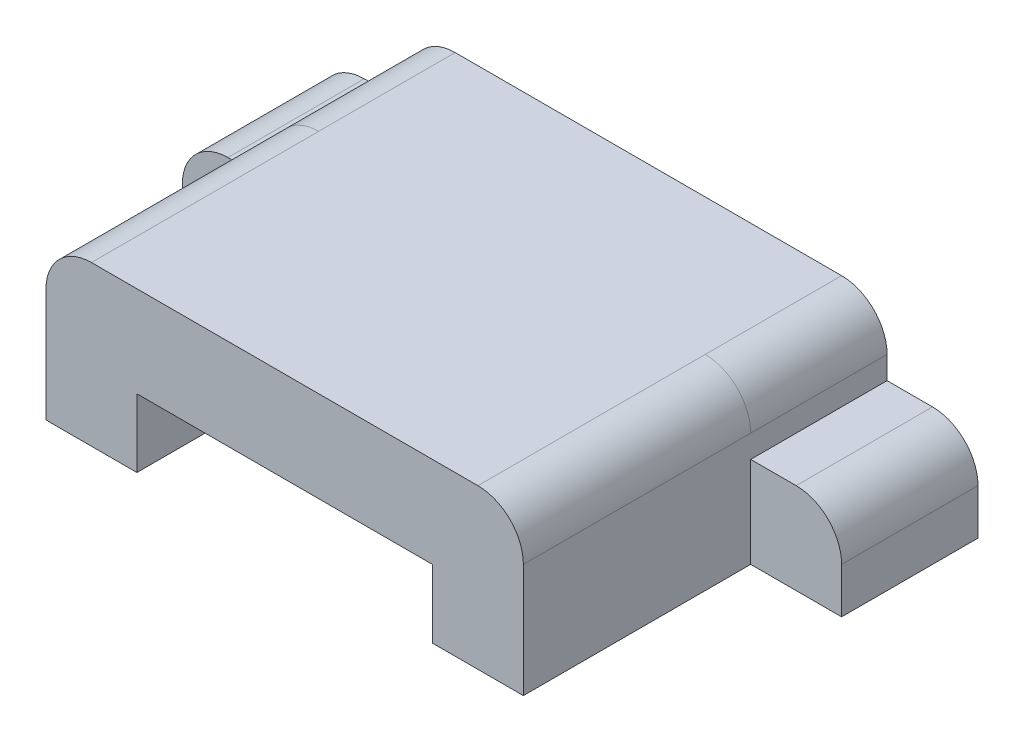
ISO-10303-21;
HEADER;
FILE_DESCRIPTION(('STEP AP214'),'2;1');
FILE_NAME('part.step','',(''),(''),'','','');
FILE_SCHEMA(('AUTOMOTIVE_DESIGN { 1 0 10303 214 1 1 1 1 }'));
ENDSEC;
DATA;
#1=APPLICATION_CONTEXT('core data for automotive mechanical design processes');
#2=APPLICATION_PROTOCOL_DEFINITION('international standard','automotive_design',2000,#1);
#3=PRODUCT_CONTEXT('',#1,'mechanical');
#4=PRODUCT('Part','Part','',(#3));
#5=PRODUCT_RELATED_PRODUCT_CATEGORY('part','',(#4));
#6=PRODUCT_DEFINITION_FORMATION('','',#4);
#7=PRODUCT_DEFINITION_CONTEXT('part definition',#1,'design');
#8=PRODUCT_DEFINITION('design','',#6,#7);
#9=PRODUCT_DEFINITION_SHAPE('','',#8);
#10=(LENGTH_UNIT() NAMED_UNIT(*) SI_UNIT(.MILLI.,.METRE.));
#11=(NAMED_UNIT(*) PLANE_ANGLE_UNIT() SI_UNIT($,.RADIAN.));
#12=(NAMED_UNIT(*) SI_UNIT($,.STERADIAN.) SOLID_ANGLE_UNIT());
#13=UNCERTAINTY_MEASURE_WITH_UNIT(LENGTH_MEASURE(1.E-05),#10,'distance_accuracy_value','');
#14=(GEOMETRIC_REPRESENTATION_CONTEXT(3) GLOBAL_UNCERTAINTY_ASSIGNED_CONTEXT((#13)) GLOBAL_UNIT_ASSIGNED_CONTEXT((#10,
#11,#12)) REPRESENTATION_CONTEXT('',''));
#15=CARTESIAN_POINT('',(0.,0.,0.));
#16=DIRECTION('',(0.,0.,1.));
#17=DIRECTION('',(1.,0.,0.));
#18=AXIS2_PLACEMENT_3D('',#15,#16,#17);
#19=CARTESIAN_POINT('',(0.,0.,6.));
#20=DIRECTION('',(0.,0.,-1.));
#21=DIRECTION('',(-1.,0.,0.));
#22=AXIS2_PLACEMENT_3D('',#19,#20,#21);
#23=PLANE('',#22);
#24=DIRECTION('',(0.,-1.,0.));
#25=VECTOR('',#24,1.);
#26=CARTESIAN_POINT('',(-12.4615384615385,-4.74358974358974,6.));
#27=LINE('',#26,#25);
#28=CARTESIAN_POINT('',(-12.4615384615385,-4.74358974358974,6.));
#29=VERTEX_POINT('',#28);
#30=CARTESIAN_POINT('',(-12.4615384615385,-8.74358974358974,6.));
#31=VERTEX_POINT('',#30);
#32=EDGE_CURVE('E220',#29,#31,#27,.T.);
#33=ORIENTED_EDGE('',*,*,#32,.F.);
#34=DIRECTION('',(-1.,0.,0.));
#35=VECTOR('',#34,1.);
#36=CARTESIAN_POINT('',(-16.4615384615385,-4.74358974358974,6.));
#37=LINE('',#36,#35);
#38=CARTESIAN_POINT('',(-14.4615384615385,-4.74358974358974,6.));
#39=VERTEX_POINT('',#38);
#40=EDGE_CURVE('E243',#29,#39,#37,.T.);
#41=ORIENTED_EDGE('',*,*,#40,.T.);
#42=CARTESIAN_POINT('',(-14.4615384615385,-6.74358974358974,6.));
#43=DIRECTION('',(0.,0.,-1.));
#44=DIRECTION('',(-1.,0.,0.));
#45=AXIS2_PLACEMENT_3D('',#42,#43,#44);
#46=CIRCLE('',#45,2.);
#47=CARTESIAN_POINT('',(-16.4615384615385,-6.74358974358974,6.));
#48=VERTEX_POINT('',#47);
#49=EDGE_CURVE('E305',#39,#48,#46,.F.);
#50=ORIENTED_EDGE('',*,*,#49,.T.);
#51=DIRECTION('',(0.,-1.,0.));
#52=VECTOR('',#51,1.);
#53=CARTESIAN_POINT('',(-16.4615384615385,-8.74358974358974,6.));
#54=LINE('',#53,#52);
#55=CARTESIAN_POINT('',(-16.4615384615385,-8.74358974358974,6.));
#56=VERTEX_POINT('',#55);
#57=EDGE_CURVE('E231',#48,#56,#54,.T.);
#58=ORIENTED_EDGE('',*,*,#57,.T.);
#59=DIRECTION('',(1.,0.,0.));
#60=VECTOR('',#59,1.);
#61=CARTESIAN_POINT('',(-16.4615384615385,-8.74358974358974,6.));
#62=LINE('',#61,#60);
#63=EDGE_CURVE('E233',#56,#31,#62,.T.);
#64=ORIENTED_EDGE('',*,*,#63,.T.);
#65=EDGE_LOOP('',(#33,#41,#50,#58,#64));
#66=FACE_BOUND('',#65,.T.);
#67=ADVANCED_FACE('F39',(#66),#23,.F.);
#68=DIRECTION('',(0.,1.,0.));
#69=VECTOR('',#68,1.);
#70=CARTESIAN_POINT('',(8.53846153846154,-1.74358974358975,6.));
#71=LINE('',#70,#69);
#72=CARTESIAN_POINT('',(8.53846153846154,-8.74358974358974,6.));
#73=VERTEX_POINT('',#72);
#74=CARTESIAN_POINT('',(8.53846153846154,-4.74358974358974,6.));
#75=VERTEX_POINT('',#74);
#76=EDGE_CURVE('E204',#73,#75,#71,.T.);
#77=ORIENTED_EDGE('',*,*,#76,.F.);
#78=DIRECTION('',(1.,0.,0.));
#79=VECTOR('',#78,1.);
#80=CARTESIAN_POINT('',(4.53846153846154,-8.74358974358975,6.));
#81=LINE('',#80,#79);
#82=CARTESIAN_POINT('',(12.5384615384615,-8.74358974358974,6.));
#83=VERTEX_POINT('',#82);
#84=EDGE_CURVE('E236',#73,#83,#81,.T.);
#85=ORIENTED_EDGE('',*,*,#84,.T.);
#86=DIRECTION('',(0.,1.,0.));
#87=VECTOR('',#86,1.);
#88=CARTESIAN_POINT('',(12.5384615384615,-4.74358974358974,6.));
#89=LINE('',#88,#87);
#90=CARTESIAN_POINT('',(12.5384615384615,-6.74358974358974,6.));
#91=VERTEX_POINT('',#90);
#92=EDGE_CURVE('E238',#83,#91,#89,.T.);
#93=ORIENTED_EDGE('',*,*,#92,.T.);
#94=CARTESIAN_POINT('',(10.5384615384615,-6.74358974358974,6.));
#95=DIRECTION('',(0.,0.,-1.));
#96=DIRECTION('',(-1.,0.,0.));
#97=AXIS2_PLACEMENT_3D('',#94,#95,#96);
#98=CIRCLE('',#97,2.);
#99=CARTESIAN_POINT('',(10.5384615384615,-4.74358974358974,6.));
#100=VERTEX_POINT('',#99);
#101=EDGE_CURVE('E307',#91,#100,#98,.F.);
#102=ORIENTED_EDGE('',*,*,#101,.T.);
#103=DIRECTION('',(-1.,0.,0.));
#104=VECTOR('',#103,1.);
#105=CARTESIAN_POINT('',(8.53846153846154,-4.74358974358974,6.));
#106=LINE('',#105,#104);
#107=EDGE_CURVE('E241',#100,#75,#106,.T.);
#108=ORIENTED_EDGE('',*,*,#107,.T.);
#109=EDGE_LOOP('',(#77,#85,#93,#102,#108));
#110=FACE_BOUND('',#109,.T.);
#111=ADVANCED_FACE('F372',(#110),#23,.F.);
#112=CARTESIAN_POINT('',(-16.4615384615385,-8.74358974358974,6.));
#113=DIRECTION('',(1.,0.,0.));
#114=DIRECTION('',(0.,0.,-1.));
#115=AXIS2_PLACEMENT_3D('',#112,#113,#114);
#116=PLANE('',#115);
#117=ORIENTED_EDGE('',*,*,#57,.F.);
#118=DIRECTION('',(0.,0.,-1.));
#119=VECTOR('',#118,1.);
#120=CARTESIAN_POINT('',(-16.4615384615385,-6.74358974358974,6.));
#121=LINE('',#120,#119);
#122=CARTESIAN_POINT('',(-16.4615384615385,-6.74358974358974,0.));
#123=VERTEX_POINT('',#122);
#124=EDGE_CURVE('E309',#48,#123,#121,.T.);
#125=ORIENTED_EDGE('',*,*,#124,.T.);
#126=DIRECTION('',(0.,-1.,0.));
#127=VECTOR('',#126,1.);
#128=CARTESIAN_POINT('',(-16.4615384615385,-8.74358974358974,0.));
#129=LINE('',#128,#127);
#130=CARTESIAN_POINT('',(-16.4615384615385,-8.74358974358974,0.));
#131=VERTEX_POINT('',#130);
#132=EDGE_CURVE('E230',#123,#131,#129,.T.);
#133=ORIENTED_EDGE('',*,*,#132,.T.);
#134=DIRECTION('',(0.,0.,-1.));
#135=VECTOR('',#134,1.);
#136=CARTESIAN_POINT('',(-16.4615384615385,-8.74358974358974,6.));
#137=LINE('',#136,#135);
#138=EDGE_CURVE('E285',#56,#131,#137,.T.);
#139=ORIENTED_EDGE('',*,*,#138,.F.);
#140=EDGE_LOOP('',(#117,#125,#133,#139));
#141=FACE_BOUND('',#140,.T.);
#142=ADVANCED_FACE('F401',(#141),#116,.F.);
#143=CARTESIAN_POINT('',(-16.4615384615385,-8.74358974358974,6.));
#144=DIRECTION('',(0.,1.,0.));
#145=DIRECTION('',(0.,0.,1.));
#146=AXIS2_PLACEMENT_3D('',#143,#144,#145);
#147=PLANE('',#146);
#148=DIRECTION('',(1.,0.,0.));
#149=VECTOR('',#148,1.);
#150=CARTESIAN_POINT('',(-16.4615384615385,-8.74358974358974,0.));
#151=LINE('',#150,#149);
#152=CARTESIAN_POINT('',(-8.46153846153846,-8.74358974358974,0.));
#153=VERTEX_POINT('',#152);
#154=EDGE_CURVE('E248',#131,#153,#151,.T.);
#155=ORIENTED_EDGE('',*,*,#154,.T.);
#156=DIRECTION('',(0.,0.,-1.));
#157=VECTOR('',#156,1.);
#158=CARTESIAN_POINT('',(-8.46153846153846,-8.74358974358974,6.));
#159=LINE('',#158,#157);
#160=CARTESIAN_POINT('',(-8.46153846153846,-8.74358974358974,16.));
#161=VERTEX_POINT('',#160);
#162=EDGE_CURVE('E282',#161,#153,#159,.T.);
#163=ORIENTED_EDGE('',*,*,#162,.F.);
#164=DIRECTION('',(1.,0.,0.));
#165=VECTOR('',#164,1.);
#166=CARTESIAN_POINT('',(-12.4615384615385,-8.74358974358974,16.));
#167=LINE('',#166,#165);
#168=CARTESIAN_POINT('',(-12.4615384615385,-8.74358974358974,16.));
#169=VERTEX_POINT('',#168);
#170=EDGE_CURVE('E216',#169,#161,#167,.T.);
#171=ORIENTED_EDGE('',*,*,#170,.F.);
#172=DIRECTION('',(0.,0.,-1.));
#173=VECTOR('',#172,1.);
#174=CARTESIAN_POINT('',(-12.4615384615385,-8.74358974358974,16.));
#175=LINE('',#174,#173);
#176=EDGE_CURVE('E218',#169,#31,#175,.T.);
#177=ORIENTED_EDGE('',*,*,#176,.T.);
#178=ORIENTED_EDGE('',*,*,#63,.F.);
#179=ORIENTED_EDGE('',*,*,#138,.T.);
#180=EDGE_LOOP('',(#155,#163,#171,#177,#178,#179));
#181=FACE_BOUND('',#180,.T.);
#182=ADVANCED_FACE('F529',(#181),#147,.F.);
#183=CARTESIAN_POINT('',(-8.46153846153846,-5.74358974358974,6.));
#184=DIRECTION('',(-1.,0.,0.));
#185=DIRECTION('',(0.,-1.,0.));
#186=AXIS2_PLACEMENT_3D('',#183,#184,#185);
#187=PLANE('',#186);
#188=DIRECTION('',(0.,1.,0.));
#189=VECTOR('',#188,1.);
#190=CARTESIAN_POINT('',(-8.46153846153846,-5.74358974358974,0.));
#191=LINE('',#190,#189);
#192=CARTESIAN_POINT('',(-8.46153846153846,-5.74358974358974,0.));
#193=VERTEX_POINT('',#192);
#194=EDGE_CURVE('E250',#153,#193,#191,.T.);
#195=ORIENTED_EDGE('',*,*,#194,.T.);
#196=DIRECTION('',(0.,0.,-1.));
#197=VECTOR('',#196,1.);
#198=CARTESIAN_POINT('',(-8.46153846153846,-5.74358974358974,6.));
#199=LINE('',#198,#197);
#200=CARTESIAN_POINT('',(-8.46153846153846,-5.74358974358974,16.));
#201=VERTEX_POINT('',#200);
#202=EDGE_CURVE('E189',#201,#193,#199,.T.);
#203=ORIENTED_EDGE('',*,*,#202,.F.);
#204=DIRECTION('',(0.,1.,0.));
#205=VECTOR('',#204,1.);
#206=CARTESIAN_POINT('',(-8.46153846153846,-5.74358974358974,16.));
#207=LINE('',#206,#205);
#208=EDGE_CURVE('E203',#161,#201,#207,.T.);
#209=ORIENTED_EDGE('',*,*,#208,.F.);
#210=ORIENTED_EDGE('',*,*,#162,.T.);
#211=EDGE_LOOP('',(#195,#203,#209,#210));
#212=FACE_BOUND('',#211,.T.);
#213=ADVANCED_FACE('F361',(#212),#187,.F.);
#214=CARTESIAN_POINT('',(-8.46153846153846,-5.74358974358974,6.));
#215=DIRECTION('',(0.,1.,0.));
#216=DIRECTION('',(-1.,0.,0.));
#217=AXIS2_PLACEMENT_3D('',#214,#215,#216);
#218=PLANE('',#217);
#219=DIRECTION('',(1.,0.,0.));
#220=VECTOR('',#219,1.);
#221=CARTESIAN_POINT('',(-8.46153846153846,-5.74358974358974,0.));
#222=LINE('',#221,#220);
#223=CARTESIAN_POINT('',(4.53846153846154,-5.74358974358975,0.));
#224=VERTEX_POINT('',#223);
#225=EDGE_CURVE('E186',#193,#224,#222,.T.);
#226=ORIENTED_EDGE('',*,*,#225,.T.);
#227=DIRECTION('',(0.,0.,-1.));
#228=VECTOR('',#227,1.);
#229=CARTESIAN_POINT('',(4.53846153846154,-5.74358974358975,6.));
#230=LINE('',#229,#228);
#231=CARTESIAN_POINT('',(4.53846153846154,-5.74358974358975,16.));
#232=VERTEX_POINT('',#231);
#233=EDGE_CURVE('E179',#232,#224,#230,.T.);
#234=ORIENTED_EDGE('',*,*,#233,.F.);
#235=DIRECTION('',(1.,0.,0.));
#236=VECTOR('',#235,1.);
#237=CARTESIAN_POINT('',(-8.46153846153846,-5.74358974358974,16.));
#238=LINE('',#237,#236);
#239=EDGE_CURVE('E184',#201,#232,#238,.T.);
#240=ORIENTED_EDGE('',*,*,#239,.F.);
#241=ORIENTED_EDGE('',*,*,#202,.T.);
#242=EDGE_LOOP('',(#226,#234,#240,#241));
#243=FACE_BOUND('',#242,.T.);
#244=ADVANCED_FACE('F181',(#243),#218,.F.);
#245=CARTESIAN_POINT('',(4.53846153846154,-5.74358974358975,6.));
#246=DIRECTION('',(1.,0.,0.));
#247=DIRECTION('',(0.,0.,-1.));
#248=AXIS2_PLACEMENT_3D('',#245,#246,#247);
#249=PLANE('',#248);
#250=DIRECTION('',(0.,-1.,0.));
#251=VECTOR('',#250,1.);
#252=CARTESIAN_POINT('',(4.53846153846154,-5.74358974358975,0.));
#253=LINE('',#252,#251);
#254=CARTESIAN_POINT('',(4.53846153846154,-8.74358974358975,0.));
#255=VERTEX_POINT('',#254);
#256=EDGE_CURVE('E253',#224,#255,#253,.T.);
#257=ORIENTED_EDGE('',*,*,#256,.T.);
#258=DIRECTION('',(0.,0.,-1.));
#259=VECTOR('',#258,1.);
#260=CARTESIAN_POINT('',(4.53846153846154,-8.74358974358975,6.));
#261=LINE('',#260,#259);
#262=CARTESIAN_POINT('',(4.53846153846154,-8.74358974358975,16.));
#263=VERTEX_POINT('',#262);
#264=EDGE_CURVE('E190',#263,#255,#261,.T.);
#265=ORIENTED_EDGE('',*,*,#264,.F.);
#266=DIRECTION('',(0.,-1.,0.));
#267=VECTOR('',#266,1.);
#268=CARTESIAN_POINT('',(4.53846153846154,-5.74358974358975,16.));
#269=LINE('',#268,#267);
#270=EDGE_CURVE('E193',#232,#263,#269,.T.);
#271=ORIENTED_EDGE('',*,*,#270,.F.);
#272=ORIENTED_EDGE('',*,*,#233,.T.);
#273=EDGE_LOOP('',(#257,#265,#271,#272));
#274=FACE_BOUND('',#273,.T.);
#275=ADVANCED_FACE('F194',(#274),#249,.F.);
#276=CARTESIAN_POINT('',(4.53846153846154,-8.74358974358975,6.));
#277=DIRECTION('',(0.,1.,0.));
#278=DIRECTION('',(-1.,0.,0.));
#279=AXIS2_PLACEMENT_3D('',#276,#277,#278);
#280=PLANE('',#279);
#281=DIRECTION('',(1.,0.,0.));
#282=VECTOR('',#281,1.);
#283=CARTESIAN_POINT('',(4.53846153846154,-8.74358974358975,0.));
#284=LINE('',#283,#282);
#285=CARTESIAN_POINT('',(12.5384615384615,-8.74358974358974,0.));
#286=VERTEX_POINT('',#285);
#287=EDGE_CURVE('E255',#255,#286,#284,.T.);
#288=ORIENTED_EDGE('',*,*,#287,.T.);
#289=DIRECTION('',(0.,0.,-1.));
#290=VECTOR('',#289,1.);
#291=CARTESIAN_POINT('',(12.5384615384615,-8.74358974358974,6.));
#292=LINE('',#291,#290);
#293=EDGE_CURVE('E277',#83,#286,#292,.T.);
#294=ORIENTED_EDGE('',*,*,#293,.F.);
#295=ORIENTED_EDGE('',*,*,#84,.F.);
#296=DIRECTION('',(0.,0.,-1.));
#297=VECTOR('',#296,1.);
#298=CARTESIAN_POINT('',(8.53846153846154,-8.74358974358974,16.));
#299=LINE('',#298,#297);
#300=CARTESIAN_POINT('',(8.53846153846154,-8.74358974358974,16.));
#301=VERTEX_POINT('',#300);
#302=EDGE_CURVE('E227',#301,#73,#299,.T.);
#303=ORIENTED_EDGE('',*,*,#302,.F.);
#304=DIRECTION('',(1.,0.,0.));
#305=VECTOR('',#304,1.);
#306=CARTESIAN_POINT('',(8.53846153846154,-8.74358974358974,16.));
#307=LINE('',#306,#305);
#308=EDGE_CURVE('E197',#263,#301,#307,.T.);
#309=ORIENTED_EDGE('',*,*,#308,.F.);
#310=ORIENTED_EDGE('',*,*,#264,.T.);
#311=EDGE_LOOP('',(#288,#294,#295,#303,#309,#310));
#312=FACE_BOUND('',#311,.T.);
#313=ADVANCED_FACE('F367',(#312),#280,.F.);
#314=CARTESIAN_POINT('',(12.5384615384615,-4.74358974358974,6.));
#315=DIRECTION('',(-1.,0.,0.));
#316=DIRECTION('',(0.,0.,1.));
#317=AXIS2_PLACEMENT_3D('',#314,#315,#316);
#318=PLANE('',#317);
#319=DIRECTION('',(0.,1.,0.));
#320=VECTOR('',#319,1.);
#321=CARTESIAN_POINT('',(12.5384615384615,-4.74358974358974,0.));
#322=LINE('',#321,#320);
#323=CARTESIAN_POINT('',(12.5384615384615,-6.74358974358974,0.));
#324=VERTEX_POINT('',#323);
#325=EDGE_CURVE('E257',#286,#324,#322,.T.);
#326=ORIENTED_EDGE('',*,*,#325,.T.);
#327=DIRECTION('',(0.,0.,-1.));
#328=VECTOR('',#327,1.);
#329=CARTESIAN_POINT('',(12.5384615384615,-6.74358974358974,6.));
#330=LINE('',#329,#328);
#331=EDGE_CURVE('E299',#324,#91,#330,.F.);
#332=ORIENTED_EDGE('',*,*,#331,.T.);
#333=ORIENTED_EDGE('',*,*,#92,.F.);
#334=ORIENTED_EDGE('',*,*,#293,.T.);
#335=EDGE_LOOP('',(#326,#332,#333,#334));
#336=FACE_BOUND('',#335,.T.);
#337=ADVANCED_FACE('F382',(#336),#318,.F.);
#338=CARTESIAN_POINT('',(8.53846153846154,-4.74358974358974,6.));
#339=DIRECTION('',(0.,-1.,0.));
#340=DIRECTION('',(0.,0.,-1.));
#341=AXIS2_PLACEMENT_3D('',#338,#339,#340);
#342=PLANE('',#341);
#343=ORIENTED_EDGE('',*,*,#107,.F.);
#344=DIRECTION('',(0.,0.,-1.));
#345=VECTOR('',#344,1.);
#346=CARTESIAN_POINT('',(10.5384615384615,-4.74358974358974,6.));
#347=LINE('',#346,#345);
#348=CARTESIAN_POINT('',(10.5384615384615,-4.74358974358974,0.));
#349=VERTEX_POINT('',#348);
#350=EDGE_CURVE('E288',#100,#349,#347,.T.);
#351=ORIENTED_EDGE('',*,*,#350,.T.);
#352=DIRECTION('',(-1.,0.,0.));
#353=VECTOR('',#352,1.);
#354=CARTESIAN_POINT('',(8.53846153846154,-4.74358974358974,0.));
#355=LINE('',#354,#353);
#356=CARTESIAN_POINT('',(8.53846153846154,-4.74358974358974,0.));
#357=VERTEX_POINT('',#356);
#358=EDGE_CURVE('E260',#349,#357,#355,.T.);
#359=ORIENTED_EDGE('',*,*,#358,.T.);
#360=DIRECTION('',(0.,0.,-1.));
#361=VECTOR('',#360,1.);
#362=CARTESIAN_POINT('',(8.53846153846154,-4.74358974358974,6.));
#363=LINE('',#362,#361);
#364=EDGE_CURVE('E274',#75,#357,#363,.T.);
#365=ORIENTED_EDGE('',*,*,#364,.F.);
#366=EDGE_LOOP('',(#343,#351,#359,#365));
#367=FACE_BOUND('',#366,.T.);
#368=ADVANCED_FACE('F377',(#367),#342,.F.);
#369=CARTESIAN_POINT('',(8.53846153846154,-1.74358974358975,6.));
#370=DIRECTION('',(-1.,0.,0.));
#371=DIRECTION('',(0.,0.,1.));
#372=AXIS2_PLACEMENT_3D('',#369,#370,#371);
#373=PLANE('',#372);
#374=DIRECTION('',(0.,0.,-1.));
#375=VECTOR('',#374,1.);
#376=CARTESIAN_POINT('',(8.53846153846154,-3.74358974358975,6.));
#377=LINE('',#376,#375);
#378=CARTESIAN_POINT('',(8.53846153846154,-3.74358974358975,0.));
#379=VERTEX_POINT('',#378);
#380=CARTESIAN_POINT('',(8.53846153846154,-3.74358974358975,6.));
#381=VERTEX_POINT('',#380);
#382=EDGE_CURVE('E319',#379,#381,#377,.F.);
#383=ORIENTED_EDGE('',*,*,#382,.T.);
#384=DIRECTION('',(0.,0.,-1.));
#385=VECTOR('',#384,1.);
#386=CARTESIAN_POINT('',(8.53846153846154,-3.74358974358975,6.));
#387=LINE('',#386,#385);
#388=CARTESIAN_POINT('',(8.53846153846154,-3.74358974358975,16.));
#389=VERTEX_POINT('',#388);
#390=EDGE_CURVE('E62',#381,#389,#387,.F.);
#391=ORIENTED_EDGE('',*,*,#390,.T.);
#392=DIRECTION('',(0.,1.,0.));
#393=VECTOR('',#392,1.);
#394=CARTESIAN_POINT('',(8.53846153846154,-4.74358974358974,16.));
#395=LINE('',#394,#393);
#396=EDGE_CURVE('E210',#301,#389,#395,.T.);
#397=ORIENTED_EDGE('',*,*,#396,.F.);
#398=ORIENTED_EDGE('',*,*,#302,.T.);
#399=ORIENTED_EDGE('',*,*,#76,.T.);
#400=ORIENTED_EDGE('',*,*,#364,.T.);
#401=DIRECTION('',(0.,1.,0.));
#402=VECTOR('',#401,1.);
#403=CARTESIAN_POINT('',(8.53846153846154,-1.74358974358975,0.));
#404=LINE('',#403,#402);
#405=EDGE_CURVE('E262',#357,#379,#404,.T.);
#406=ORIENTED_EDGE('',*,*,#405,.T.);
#407=EDGE_LOOP('',(#383,#391,#397,#398,#399,#400,#406));
#408=FACE_BOUND('',#407,.T.);
#409=ADVANCED_FACE('F340',(#408),#373,.F.);
#410=CARTESIAN_POINT('',(-12.4615384615385,-1.74358974358975,6.));
#411=DIRECTION('',(0.,-1.,0.));
#412=DIRECTION('',(0.,0.,-1.));
#413=AXIS2_PLACEMENT_3D('',#410,#411,#412);
#414=PLANE('',#413);
#415=DIRECTION('',(-1.,0.,0.));
#416=VECTOR('',#415,1.);
#417=CARTESIAN_POINT('',(-10.4615384615385,-1.74358974358975,16.));
#418=LINE('',#417,#416);
#419=CARTESIAN_POINT('',(6.53846153846154,-1.74358974358975,16.));
#420=VERTEX_POINT('',#419);
#421=CARTESIAN_POINT('',(-10.4615384615385,-1.74358974358975,16.));
#422=VERTEX_POINT('',#421);
#423=EDGE_CURVE('E212',#420,#422,#418,.T.);
#424=ORIENTED_EDGE('',*,*,#423,.F.);
#425=DIRECTION('',(0.,0.,-1.));
#426=VECTOR('',#425,1.);
#427=CARTESIAN_POINT('',(6.53846153846154,-1.74358974358975,6.));
#428=LINE('',#427,#426);
#429=CARTESIAN_POINT('',(6.53846153846153,-1.74358974358975,6.));
#430=VERTEX_POINT('',#429);
#431=EDGE_CURVE('E324',#420,#430,#428,.T.);
#432=ORIENTED_EDGE('',*,*,#431,.T.);
#433=DIRECTION('',(0.,0.,-1.));
#434=VECTOR('',#433,1.);
#435=CARTESIAN_POINT('',(6.53846153846154,-1.74358974358975,6.));
#436=LINE('',#435,#434);
#437=CARTESIAN_POINT('',(6.53846153846153,-1.74358974358975,0.));
#438=VERTEX_POINT('',#437);
#439=EDGE_CURVE('E316',#430,#438,#436,.T.);
#440=ORIENTED_EDGE('',*,*,#439,.T.);
#441=DIRECTION('',(-1.,0.,0.));
#442=VECTOR('',#441,1.);
#443=CARTESIAN_POINT('',(-12.4615384615385,-1.74358974358975,0.));
#444=LINE('',#443,#442);
#445=CARTESIAN_POINT('',(-10.4615384615385,-1.74358974358975,0.));
#446=VERTEX_POINT('',#445);
#447=EDGE_CURVE('E265',#438,#446,#444,.T.);
#448=ORIENTED_EDGE('',*,*,#447,.T.);
#449=DIRECTION('',(0.,0.,-1.));
#450=VECTOR('',#449,1.);
#451=CARTESIAN_POINT('',(-10.4615384615385,-1.74358974358975,6.));
#452=LINE('',#451,#450);
#453=CARTESIAN_POINT('',(-10.4615384615385,-1.74358974358975,6.));
#454=VERTEX_POINT('',#453);
#455=EDGE_CURVE('E314',#446,#454,#452,.F.);
#456=ORIENTED_EDGE('',*,*,#455,.T.);
#457=DIRECTION('',(0.,0.,-1.));
#458=VECTOR('',#457,1.);
#459=CARTESIAN_POINT('',(-10.4615384615385,-1.74358974358975,6.));
#460=LINE('',#459,#458);
#461=EDGE_CURVE('E223',#454,#422,#460,.F.);
#462=ORIENTED_EDGE('',*,*,#461,.T.);
#463=EDGE_LOOP('',(#424,#432,#440,#448,#456,#462));
#464=FACE_BOUND('',#463,.T.);
#465=ADVANCED_FACE('F333',(#464),#414,.F.);
#466=CARTESIAN_POINT('',(-12.4615384615385,-4.74358974358974,6.));
#467=DIRECTION('',(1.,0.,0.));
#468=DIRECTION('',(0.,0.,-1.));
#469=AXIS2_PLACEMENT_3D('',#466,#467,#468);
#470=PLANE('',#469);
#471=DIRECTION('',(0.,-1.,0.));
#472=VECTOR('',#471,1.);
#473=CARTESIAN_POINT('',(-12.4615384615385,-1.74358974358975,16.));
#474=LINE('',#473,#472);
#475=CARTESIAN_POINT('',(-12.4615384615385,-3.74358974358975,16.));
#476=VERTEX_POINT('',#475);
#477=EDGE_CURVE('E214',#476,#169,#474,.T.);
#478=ORIENTED_EDGE('',*,*,#477,.F.);
#479=DIRECTION('',(0.,0.,-1.));
#480=VECTOR('',#479,1.);
#481=CARTESIAN_POINT('',(-12.4615384615385,-3.74358974358975,6.));
#482=LINE('',#481,#480);
#483=CARTESIAN_POINT('',(-12.4615384615385,-3.74358974358975,6.));
#484=VERTEX_POINT('',#483);
#485=EDGE_CURVE('E11',#476,#484,#482,.T.);
#486=ORIENTED_EDGE('',*,*,#485,.T.);
#487=DIRECTION('',(0.,0.,-1.));
#488=VECTOR('',#487,1.);
#489=CARTESIAN_POINT('',(-12.4615384615385,-3.74358974358975,6.));
#490=LINE('',#489,#488);
#491=CARTESIAN_POINT('',(-12.4615384615385,-3.74358974358975,0.));
#492=VERTEX_POINT('',#491);
#493=EDGE_CURVE('E224',#484,#492,#490,.T.);
#494=ORIENTED_EDGE('',*,*,#493,.T.);
#495=DIRECTION('',(0.,-1.,0.));
#496=VECTOR('',#495,1.);
#497=CARTESIAN_POINT('',(-12.4615384615385,-4.74358974358974,0.));
#498=LINE('',#497,#496);
#499=CARTESIAN_POINT('',(-12.4615384615385,-4.74358974358974,0.));
#500=VERTEX_POINT('',#499);
#501=EDGE_CURVE('E268',#492,#500,#498,.T.);
#502=ORIENTED_EDGE('',*,*,#501,.T.);
#503=DIRECTION('',(0.,0.,-1.));
#504=VECTOR('',#503,1.);
#505=CARTESIAN_POINT('',(-12.4615384615385,-4.74358974358974,6.));
#506=LINE('',#505,#504);
#507=EDGE_CURVE('E246',#29,#500,#506,.T.);
#508=ORIENTED_EDGE('',*,*,#507,.F.);
#509=ORIENTED_EDGE('',*,*,#32,.T.);
#510=ORIENTED_EDGE('',*,*,#176,.F.);
#511=EDGE_LOOP('',(#478,#486,#494,#502,#508,#509,#510));
#512=FACE_BOUND('',#511,.T.);
#513=ADVANCED_FACE('F355',(#512),#470,.F.);
#514=CARTESIAN_POINT('',(-16.4615384615385,-4.74358974358974,6.));
#515=DIRECTION('',(0.,-1.,0.));
#516=DIRECTION('',(0.,0.,-1.));
#517=AXIS2_PLACEMENT_3D('',#514,#515,#516);
#518=PLANE('',#517);
#519=DIRECTION('',(-1.,0.,0.));
#520=VECTOR('',#519,1.);
#521=CARTESIAN_POINT('',(-16.4615384615385,-4.74358974358974,0.));
#522=LINE('',#521,#520);
#523=CARTESIAN_POINT('',(-14.4615384615385,-4.74358974358974,0.));
#524=VERTEX_POINT('',#523);
#525=EDGE_CURVE('E234',#500,#524,#522,.T.);
#526=ORIENTED_EDGE('',*,*,#525,.T.);
#527=DIRECTION('',(0.,0.,-1.));
#528=VECTOR('',#527,1.);
#529=CARTESIAN_POINT('',(-14.4615384615385,-4.74358974358974,6.));
#530=LINE('',#529,#528);
#531=EDGE_CURVE('E312',#524,#39,#530,.F.);
#532=ORIENTED_EDGE('',*,*,#531,.T.);
#533=ORIENTED_EDGE('',*,*,#40,.F.);
#534=ORIENTED_EDGE('',*,*,#507,.T.);
#535=EDGE_LOOP('',(#526,#532,#533,#534));
#536=FACE_BOUND('',#535,.T.);
#537=ADVANCED_FACE('F406',(#536),#518,.F.);
#538=CARTESIAN_POINT('',(0.,0.,0.));
#539=DIRECTION('',(0.,0.,-1.));
#540=DIRECTION('',(-1.,0.,0.));
#541=AXIS2_PLACEMENT_3D('',#538,#539,#540);
#542=PLANE('',#541);
#543=ORIENTED_EDGE('',*,*,#358,.F.);
#544=CARTESIAN_POINT('',(10.5384615384615,-6.74358974358974,0.));
#545=DIRECTION('',(0.,0.,-1.));
#546=DIRECTION('',(-1.,0.,0.));
#547=AXIS2_PLACEMENT_3D('',#544,#545,#546);
#548=CIRCLE('',#547,2.);
#549=EDGE_CURVE('E297',#349,#324,#548,.T.);
#550=ORIENTED_EDGE('',*,*,#549,.T.);
#551=ORIENTED_EDGE('',*,*,#325,.F.);
#552=ORIENTED_EDGE('',*,*,#287,.F.);
#553=ORIENTED_EDGE('',*,*,#256,.F.);
#554=ORIENTED_EDGE('',*,*,#225,.F.);
#555=ORIENTED_EDGE('',*,*,#194,.F.);
#556=ORIENTED_EDGE('',*,*,#154,.F.);
#557=ORIENTED_EDGE('',*,*,#132,.F.);
#558=CARTESIAN_POINT('',(-14.4615384615385,-6.74358974358974,0.));
#559=DIRECTION('',(0.,0.,-1.));
#560=DIRECTION('',(-1.,0.,0.));
#561=AXIS2_PLACEMENT_3D('',#558,#559,#560);
#562=CIRCLE('',#561,2.);
#563=EDGE_CURVE('E295',#123,#524,#562,.T.);
#564=ORIENTED_EDGE('',*,*,#563,.T.);
#565=ORIENTED_EDGE('',*,*,#525,.F.);
#566=ORIENTED_EDGE('',*,*,#501,.F.);
#567=CARTESIAN_POINT('',(-10.4615384615385,-3.74358974358975,0.));
#568=DIRECTION('',(0.,0.,-1.));
#569=DIRECTION('',(-1.,0.,0.));
#570=AXIS2_PLACEMENT_3D('',#567,#568,#569);
#571=CIRCLE('',#570,2.);
#572=EDGE_CURVE('E291',#492,#446,#571,.T.);
#573=ORIENTED_EDGE('',*,*,#572,.T.);
#574=ORIENTED_EDGE('',*,*,#447,.F.);
#575=CARTESIAN_POINT('',(6.53846153846154,-3.74358974358975,0.));
#576=DIRECTION('',(0.,0.,-1.));
#577=DIRECTION('',(-1.,0.,0.));
#578=AXIS2_PLACEMENT_3D('',#575,#576,#577);
#579=CIRCLE('',#578,2.);
#580=EDGE_CURVE('E293',#438,#379,#579,.T.);
#581=ORIENTED_EDGE('',*,*,#580,.T.);
#582=ORIENTED_EDGE('',*,*,#405,.F.);
#583=EDGE_LOOP('',(#543,#550,#551,#552,#553,#554,#555,#556,#557,#564,#565,#566,#573,#574,#581,#582));
#584=FACE_BOUND('',#583,.T.);
#585=ADVANCED_FACE('F345',(#584),#542,.T.);
#586=CARTESIAN_POINT('',(10.5384615384615,-6.74358974358974,6.));
#587=DIRECTION('',(0.,0.,-1.));
#588=DIRECTION('',(-1.,0.,0.));
#589=AXIS2_PLACEMENT_3D('',#586,#587,#588);
#590=CYLINDRICAL_SURFACE('',#589,2.);
#591=ORIENTED_EDGE('',*,*,#101,.F.);
#592=ORIENTED_EDGE('',*,*,#331,.F.);
#593=ORIENTED_EDGE('',*,*,#549,.F.);
#594=ORIENTED_EDGE('',*,*,#350,.F.);
#595=EDGE_LOOP('',(#591,#592,#593,#594));
#596=FACE_BOUND('',#595,.T.);
#597=ADVANCED_FACE('F379',(#596),#590,.T.);
#598=CARTESIAN_POINT('',(-14.4615384615385,-6.74358974358974,6.));
#599=DIRECTION('',(0.,0.,-1.));
#600=DIRECTION('',(-1.,0.,0.));
#601=AXIS2_PLACEMENT_3D('',#598,#599,#600);
#602=CYLINDRICAL_SURFACE('',#601,2.);
#603=ORIENTED_EDGE('',*,*,#49,.F.);
#604=ORIENTED_EDGE('',*,*,#531,.F.);
#605=ORIENTED_EDGE('',*,*,#563,.F.);
#606=ORIENTED_EDGE('',*,*,#124,.F.);
#607=EDGE_LOOP('',(#603,#604,#605,#606));
#608=FACE_BOUND('',#607,.T.);
#609=ADVANCED_FACE('F471',(#608),#602,.T.);
#610=CARTESIAN_POINT('',(6.53846153846154,-3.74358974358975,6.));
#611=DIRECTION('',(0.,0.,-1.));
#612=DIRECTION('',(-1.,0.,0.));
#613=AXIS2_PLACEMENT_3D('',#610,#611,#612);
#614=CYLINDRICAL_SURFACE('',#613,2.);
#615=CARTESIAN_POINT('',(6.53846153846154,-3.74358974358975,6.));
#616=DIRECTION('',(0.,0.,-1.));
#617=DIRECTION('',(-1.,0.,0.));
#618=AXIS2_PLACEMENT_3D('',#615,#616,#617);
#619=CIRCLE('',#618,2.);
#620=EDGE_CURVE('E303',#381,#430,#619,.F.);
#621=ORIENTED_EDGE('',*,*,#620,.F.);
#622=ORIENTED_EDGE('',*,*,#382,.F.);
#623=ORIENTED_EDGE('',*,*,#580,.F.);
#624=ORIENTED_EDGE('',*,*,#439,.F.);
#625=EDGE_LOOP('',(#621,#622,#623,#624));
#626=FACE_BOUND('',#625,.T.);
#627=ADVANCED_FACE('F339',(#626),#614,.T.);
#628=CARTESIAN_POINT('',(-10.4615384615385,-3.74358974358975,6.));
#629=DIRECTION('',(0.,0.,-1.));
#630=DIRECTION('',(-1.,0.,0.));
#631=AXIS2_PLACEMENT_3D('',#628,#629,#630);
#632=CYLINDRICAL_SURFACE('',#631,2.);
#633=CARTESIAN_POINT('',(-10.4615384615385,-3.74358974358975,6.));
#634=DIRECTION('',(0.,0.,-1.));
#635=DIRECTION('',(-1.,0.,0.));
#636=AXIS2_PLACEMENT_3D('',#633,#634,#635);
#637=CIRCLE('',#636,2.);
#638=EDGE_CURVE('E301',#454,#484,#637,.F.);
#639=ORIENTED_EDGE('',*,*,#638,.F.);
#640=ORIENTED_EDGE('',*,*,#455,.F.);
#641=ORIENTED_EDGE('',*,*,#572,.F.);
#642=ORIENTED_EDGE('',*,*,#493,.F.);
#643=EDGE_LOOP('',(#639,#640,#641,#642));
#644=FACE_BOUND('',#643,.T.);
#645=ADVANCED_FACE('F350',(#644),#632,.T.);
#646=CARTESIAN_POINT('',(0.,0.,16.));
#647=DIRECTION('',(0.,0.,-1.));
#648=DIRECTION('',(-1.,0.,0.));
#649=AXIS2_PLACEMENT_3D('',#646,#647,#648);
#650=PLANE('',#649);
#651=ORIENTED_EDGE('',*,*,#396,.T.);
#652=CARTESIAN_POINT('',(6.53846153846154,-3.74358974358975,16.));
#653=DIRECTION('',(0.,0.,-1.));
#654=DIRECTION('',(-1.,0.,0.));
#655=AXIS2_PLACEMENT_3D('',#652,#653,#654);
#656=CIRCLE('',#655,2.);
#657=EDGE_CURVE('E47',#389,#420,#656,.F.);
#658=ORIENTED_EDGE('',*,*,#657,.T.);
#659=ORIENTED_EDGE('',*,*,#423,.T.);
#660=CARTESIAN_POINT('',(-10.4615384615385,-3.74358974358975,16.));
#661=DIRECTION('',(0.,0.,-1.));
#662=DIRECTION('',(-1.,0.,0.));
#663=AXIS2_PLACEMENT_3D('',#660,#661,#662);
#664=CIRCLE('',#663,2.);
#665=EDGE_CURVE('E54',#422,#476,#664,.F.);
#666=ORIENTED_EDGE('',*,*,#665,.T.);
#667=ORIENTED_EDGE('',*,*,#477,.T.);
#668=ORIENTED_EDGE('',*,*,#170,.T.);
#669=ORIENTED_EDGE('',*,*,#208,.T.);
#670=ORIENTED_EDGE('',*,*,#239,.T.);
#671=ORIENTED_EDGE('',*,*,#270,.T.);
#672=ORIENTED_EDGE('',*,*,#308,.T.);
#673=EDGE_LOOP('',(#651,#658,#659,#666,#667,#668,#669,#670,#671,#672));
#674=FACE_BOUND('',#673,.T.);
#675=ADVANCED_FACE('F200',(#674),#650,.F.);
#676=CARTESIAN_POINT('',(6.53846153846154,-3.74358974358975,6.));
#677=DIRECTION('',(0.,0.,-1.));
#678=DIRECTION('',(-1.,0.,0.));
#679=AXIS2_PLACEMENT_3D('',#676,#677,#678);
#680=CYLINDRICAL_SURFACE('',#679,2.);
#681=ORIENTED_EDGE('',*,*,#657,.F.);
#682=ORIENTED_EDGE('',*,*,#390,.F.);
#683=ORIENTED_EDGE('',*,*,#620,.T.);
#684=ORIENTED_EDGE('',*,*,#431,.F.);
#685=EDGE_LOOP('',(#681,#682,#683,#684));
#686=FACE_BOUND('',#685,.T.);
#687=ADVANCED_FACE('F336',(#686),#680,.T.);
#688=CARTESIAN_POINT('',(-10.4615384615385,-3.74358974358975,6.));
#689=DIRECTION('',(0.,0.,-1.));
#690=DIRECTION('',(-1.,0.,0.));
#691=AXIS2_PLACEMENT_3D('',#688,#689,#690);
#692=CYLINDRICAL_SURFACE('',#691,2.);
#693=ORIENTED_EDGE('',*,*,#665,.F.);
#694=ORIENTED_EDGE('',*,*,#461,.F.);
#695=ORIENTED_EDGE('',*,*,#638,.T.);
#696=ORIENTED_EDGE('',*,*,#485,.F.);
#697=EDGE_LOOP('',(#693,#694,#695,#696));
#698=FACE_BOUND('',#697,.T.);
#699=ADVANCED_FACE('F41',(#698),#692,.T.);
#700=CLOSED_SHELL('',(#67,#111,#142,#182,#213,#244,#275,#313,#337,#368,#409,#465,#513,#537,#585,
#597,#609,#627,#645,#675,#687,#699));
#701=MANIFOLD_SOLID_BREP('B2',#700);
#702=ADVANCED_BREP_SHAPE_REPRESENTATION('',(#18,#701),#14);
#703=SHAPE_DEFINITION_REPRESENTATION(#9,#702);
ENDSEC;
END-ISO-10303-21;
